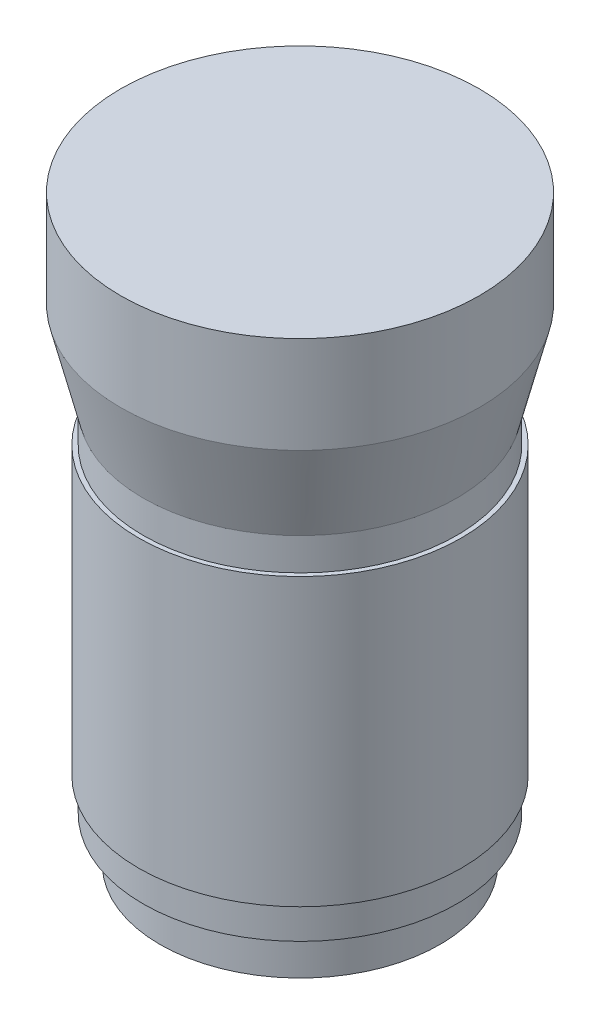
ISO-10303-21;
HEADER;
FILE_DESCRIPTION(('STEP AP214'),'2;1');
FILE_NAME('part.step','',(''),(''),'','','');
FILE_SCHEMA(('AUTOMOTIVE_DESIGN { 1 0 10303 214 1 1 1 1 }'));
ENDSEC;
DATA;
#1=APPLICATION_CONTEXT('core data for automotive mechanical design processes');
#2=APPLICATION_PROTOCOL_DEFINITION('international standard','automotive_design',2000,#1);
#3=PRODUCT_CONTEXT('',#1,'mechanical');
#4=PRODUCT('Part','Part','',(#3));
#5=PRODUCT_RELATED_PRODUCT_CATEGORY('part','',(#4));
#6=PRODUCT_DEFINITION_FORMATION('','',#4);
#7=PRODUCT_DEFINITION_CONTEXT('part definition',#1,'design');
#8=PRODUCT_DEFINITION('design','',#6,#7);
#9=PRODUCT_DEFINITION_SHAPE('','',#8);
#10=(LENGTH_UNIT() NAMED_UNIT(*) SI_UNIT(.MILLI.,.METRE.));
#11=(NAMED_UNIT(*) PLANE_ANGLE_UNIT() SI_UNIT($,.RADIAN.));
#12=(NAMED_UNIT(*) SI_UNIT($,.STERADIAN.) SOLID_ANGLE_UNIT());
#13=UNCERTAINTY_MEASURE_WITH_UNIT(LENGTH_MEASURE(1.E-05),#10,'distance_accuracy_value','');
#14=(GEOMETRIC_REPRESENTATION_CONTEXT(3) GLOBAL_UNCERTAINTY_ASSIGNED_CONTEXT((#13)) GLOBAL_UNIT_ASSIGNED_CONTEXT((#10,
#11,#12)) REPRESENTATION_CONTEXT('',''));
#15=CARTESIAN_POINT('',(0.,0.,0.));
#16=DIRECTION('',(0.,0.,1.));
#17=DIRECTION('',(1.,0.,0.));
#18=AXIS2_PLACEMENT_3D('',#15,#16,#17);
#19=CARTESIAN_POINT('',(0.,4.88,0.));
#20=DIRECTION('',(0.,-1.,0.));
#21=DIRECTION('',(0.,0.,-1.));
#22=AXIS2_PLACEMENT_3D('',#19,#20,#21);
#23=CYLINDRICAL_SURFACE('',#22,15.605);
#24=CARTESIAN_POINT('',(0.,4.88,0.));
#25=DIRECTION('',(0.,1.,0.));
#26=DIRECTION('',(0.,0.,1.));
#27=AXIS2_PLACEMENT_3D('',#24,#25,#26);
#28=CIRCLE('',#27,15.605);
#29=CARTESIAN_POINT('',(0.,4.88,15.605));
#30=VERTEX_POINT('',#29);
#31=EDGE_CURVE('E10',#30,#30,#28,.T.);
#32=ORIENTED_EDGE('',*,*,#31,.F.);
#33=EDGE_LOOP('',(#32));
#34=FACE_BOUND('',#33,.T.);
#35=CARTESIAN_POINT('',(0.,0.,0.));
#36=DIRECTION('',(0.,1.,0.));
#37=DIRECTION('',(0.,0.,1.));
#38=AXIS2_PLACEMENT_3D('',#35,#36,#37);
#39=CIRCLE('',#38,15.605);
#40=CARTESIAN_POINT('',(0.,0.,15.605));
#41=VERTEX_POINT('',#40);
#42=EDGE_CURVE('E45',#41,#41,#39,.T.);
#43=ORIENTED_EDGE('',*,*,#42,.T.);
#44=EDGE_LOOP('',(#43));
#45=FACE_BOUND('',#44,.T.);
#46=ADVANCED_FACE('F36',(#34,#45),#23,.T.);
#47=CARTESIAN_POINT('',(0.,0.,0.));
#48=DIRECTION('',(0.,1.,0.));
#49=DIRECTION('',(0.,0.,1.));
#50=AXIS2_PLACEMENT_3D('',#47,#48,#49);
#51=PLANE('',#50);
#52=ORIENTED_EDGE('',*,*,#42,.F.);
#53=EDGE_LOOP('',(#52));
#54=FACE_BOUND('',#53,.T.);
#55=ADVANCED_FACE('F112',(#54),#51,.F.);
#56=CARTESIAN_POINT('',(0.,8.58,0.));
#57=DIRECTION('',(0.,-1.,0.));
#58=DIRECTION('',(0.,0.,-1.));
#59=AXIS2_PLACEMENT_3D('',#56,#57,#58);
#60=CYLINDRICAL_SURFACE('',#59,17.5);
#61=CARTESIAN_POINT('',(0.,8.58,0.));
#62=DIRECTION('',(0.,1.,0.));
#63=DIRECTION('',(0.,0.,1.));
#64=AXIS2_PLACEMENT_3D('',#61,#62,#63);
#65=CIRCLE('',#64,17.5);
#66=CARTESIAN_POINT('',(0.,8.58,17.5));
#67=VERTEX_POINT('',#66);
#68=EDGE_CURVE('E50',#67,#67,#65,.T.);
#69=ORIENTED_EDGE('',*,*,#68,.F.);
#70=EDGE_LOOP('',(#69));
#71=FACE_BOUND('',#70,.T.);
#72=CARTESIAN_POINT('',(0.,4.88,0.));
#73=DIRECTION('',(0.,1.,0.));
#74=DIRECTION('',(0.,0.,1.));
#75=AXIS2_PLACEMENT_3D('',#72,#73,#74);
#76=CIRCLE('',#75,17.5);
#77=CARTESIAN_POINT('',(0.,4.88,17.5));
#78=VERTEX_POINT('',#77);
#79=EDGE_CURVE('E53',#78,#78,#76,.T.);
#80=ORIENTED_EDGE('',*,*,#79,.T.);
#81=EDGE_LOOP('',(#80));
#82=FACE_BOUND('',#81,.T.);
#83=ADVANCED_FACE('F110',(#71,#82),#60,.T.);
#84=CARTESIAN_POINT('',(0.,4.88,0.));
#85=DIRECTION('',(0.,1.,0.));
#86=DIRECTION('',(0.,0.,1.));
#87=AXIS2_PLACEMENT_3D('',#84,#85,#86);
#88=PLANE('',#87);
#89=ORIENTED_EDGE('',*,*,#31,.T.);
#90=EDGE_LOOP('',(#89));
#91=FACE_BOUND('',#90,.T.);
#92=ORIENTED_EDGE('',*,*,#79,.F.);
#93=EDGE_LOOP('',(#92));
#94=FACE_BOUND('',#93,.T.);
#95=ADVANCED_FACE('F106',(#91,#94),#88,.F.);
#96=CARTESIAN_POINT('',(0.,40.48,0.));
#97=DIRECTION('',(0.,-1.,0.));
#98=DIRECTION('',(0.,0.,-1.));
#99=AXIS2_PLACEMENT_3D('',#96,#97,#98);
#100=CYLINDRICAL_SURFACE('',#99,18.);
#101=CARTESIAN_POINT('',(0.,40.48,0.));
#102=DIRECTION('',(0.,1.,0.));
#103=DIRECTION('',(0.,0.,1.));
#104=AXIS2_PLACEMENT_3D('',#101,#102,#103);
#105=CIRCLE('',#104,18.);
#106=CARTESIAN_POINT('',(0.,40.48,18.));
#107=VERTEX_POINT('',#106);
#108=EDGE_CURVE('E193',#107,#107,#105,.T.);
#109=ORIENTED_EDGE('',*,*,#108,.F.);
#110=EDGE_LOOP('',(#109));
#111=FACE_BOUND('',#110,.T.);
#112=CARTESIAN_POINT('',(0.,8.58,0.));
#113=DIRECTION('',(0.,1.,0.));
#114=DIRECTION('',(0.,0.,1.));
#115=AXIS2_PLACEMENT_3D('',#112,#113,#114);
#116=CIRCLE('',#115,18.);
#117=CARTESIAN_POINT('',(0.,8.58,18.));
#118=VERTEX_POINT('',#117);
#119=EDGE_CURVE('E195',#118,#118,#116,.T.);
#120=ORIENTED_EDGE('',*,*,#119,.T.);
#121=EDGE_LOOP('',(#120));
#122=FACE_BOUND('',#121,.T.);
#123=ADVANCED_FACE('F99',(#111,#122),#100,.T.);
#124=CARTESIAN_POINT('',(0.,40.48,0.));
#125=DIRECTION('',(0.,1.,0.));
#126=DIRECTION('',(0.,0.,1.));
#127=AXIS2_PLACEMENT_3D('',#124,#125,#126);
#128=PLANE('',#127);
#129=CARTESIAN_POINT('',(0.,40.48,0.));
#130=DIRECTION('',(0.,1.,0.));
#131=DIRECTION('',(0.,0.,1.));
#132=AXIS2_PLACEMENT_3D('',#129,#130,#131);
#133=CIRCLE('',#132,17.5);
#134=CARTESIAN_POINT('',(0.,40.48,17.5));
#135=VERTEX_POINT('',#134);
#136=EDGE_CURVE('E63',#135,#135,#133,.T.);
#137=ORIENTED_EDGE('',*,*,#136,.F.);
#138=EDGE_LOOP('',(#137));
#139=FACE_BOUND('',#138,.T.);
#140=ORIENTED_EDGE('',*,*,#108,.T.);
#141=EDGE_LOOP('',(#140));
#142=FACE_BOUND('',#141,.T.);
#143=ADVANCED_FACE('F96',(#139,#142),#128,.T.);
#144=CARTESIAN_POINT('',(0.,8.58,0.));
#145=DIRECTION('',(0.,1.,0.));
#146=DIRECTION('',(0.,0.,1.));
#147=AXIS2_PLACEMENT_3D('',#144,#145,#146);
#148=PLANE('',#147);
#149=ORIENTED_EDGE('',*,*,#68,.T.);
#150=EDGE_LOOP('',(#149));
#151=FACE_BOUND('',#150,.T.);
#152=ORIENTED_EDGE('',*,*,#119,.F.);
#153=EDGE_LOOP('',(#152));
#154=FACE_BOUND('',#153,.T.);
#155=ADVANCED_FACE('F94',(#151,#154),#148,.F.);
#156=CARTESIAN_POINT('',(0.,44.08,0.));
#157=DIRECTION('',(0.,-1.,0.));
#158=DIRECTION('',(0.,0.,-1.));
#159=AXIS2_PLACEMENT_3D('',#156,#157,#158);
#160=CYLINDRICAL_SURFACE('',#159,17.5);
#161=CARTESIAN_POINT('',(0.,44.08,0.));
#162=DIRECTION('',(0.,1.,0.));
#163=DIRECTION('',(0.,0.,1.));
#164=AXIS2_PLACEMENT_3D('',#161,#162,#163);
#165=CIRCLE('',#164,17.5);
#166=CARTESIAN_POINT('',(0.,44.08,17.5));
#167=VERTEX_POINT('',#166);
#168=EDGE_CURVE('E66',#167,#167,#165,.T.);
#169=ORIENTED_EDGE('',*,*,#168,.F.);
#170=EDGE_LOOP('',(#169));
#171=FACE_BOUND('',#170,.T.);
#172=ORIENTED_EDGE('',*,*,#136,.T.);
#173=EDGE_LOOP('',(#172));
#174=FACE_BOUND('',#173,.T.);
#175=ADVANCED_FACE('F91',(#171,#174),#160,.T.);
#176=CARTESIAN_POINT('',(0.,44.08,0.));
#177=DIRECTION('',(0.,1.,0.));
#178=DIRECTION('',(0.,0.,1.));
#179=AXIS2_PLACEMENT_3D('',#176,#177,#178);
#180=CONICAL_SURFACE('',#179,17.5,0.244346095279206);
#181=CARTESIAN_POINT('',(0.,54.08,0.));
#182=DIRECTION('',(0.,1.,0.));
#183=DIRECTION('',(0.,0.,1.));
#184=AXIS2_PLACEMENT_3D('',#181,#182,#183);
#185=CIRCLE('',#184,20.);
#186=CARTESIAN_POINT('',(0.,54.08,20.));
#187=VERTEX_POINT('',#186);
#188=EDGE_CURVE('E58',#187,#187,#185,.T.);
#189=ORIENTED_EDGE('',*,*,#188,.F.);
#190=EDGE_LOOP('',(#189));
#191=FACE_BOUND('',#190,.T.);
#192=ORIENTED_EDGE('',*,*,#168,.T.);
#193=EDGE_LOOP('',(#192));
#194=FACE_BOUND('',#193,.T.);
#195=ADVANCED_FACE('F59',(#191,#194),#180,.T.);
#196=CARTESIAN_POINT('',(0.,64.88,0.));
#197=DIRECTION('',(0.,-1.,0.));
#198=DIRECTION('',(0.,0.,-1.));
#199=AXIS2_PLACEMENT_3D('',#196,#197,#198);
#200=CYLINDRICAL_SURFACE('',#199,20.);
#201=CARTESIAN_POINT('',(0.,64.88,0.));
#202=DIRECTION('',(0.,1.,0.));
#203=DIRECTION('',(0.,0.,1.));
#204=AXIS2_PLACEMENT_3D('',#201,#202,#203);
#205=CIRCLE('',#204,20.);
#206=CARTESIAN_POINT('',(0.,64.88,20.));
#207=VERTEX_POINT('',#206);
#208=EDGE_CURVE('E64',#207,#207,#205,.T.);
#209=ORIENTED_EDGE('',*,*,#208,.F.);
#210=EDGE_LOOP('',(#209));
#211=FACE_BOUND('',#210,.T.);
#212=ORIENTED_EDGE('',*,*,#188,.T.);
#213=EDGE_LOOP('',(#212));
#214=FACE_BOUND('',#213,.T.);
#215=ADVANCED_FACE('F77',(#211,#214),#200,.T.);
#216=CARTESIAN_POINT('',(0.,64.88,0.));
#217=DIRECTION('',(0.,1.,0.));
#218=DIRECTION('',(0.,0.,1.));
#219=AXIS2_PLACEMENT_3D('',#216,#217,#218);
#220=PLANE('',#219);
#221=ORIENTED_EDGE('',*,*,#208,.T.);
#222=EDGE_LOOP('',(#221));
#223=FACE_BOUND('',#222,.T.);
#224=ADVANCED_FACE('F86',(#223),#220,.T.);
#225=CLOSED_SHELL('',(#46,#55,#83,#95,#123,#143,#155,#175,#195,#215,#224));
#226=MANIFOLD_SOLID_BREP('B2',#225);
#227=ADVANCED_BREP_SHAPE_REPRESENTATION('',(#18,#226),#14);
#228=SHAPE_DEFINITION_REPRESENTATION(#9,#227);
ENDSEC;
END-ISO-10303-21;
